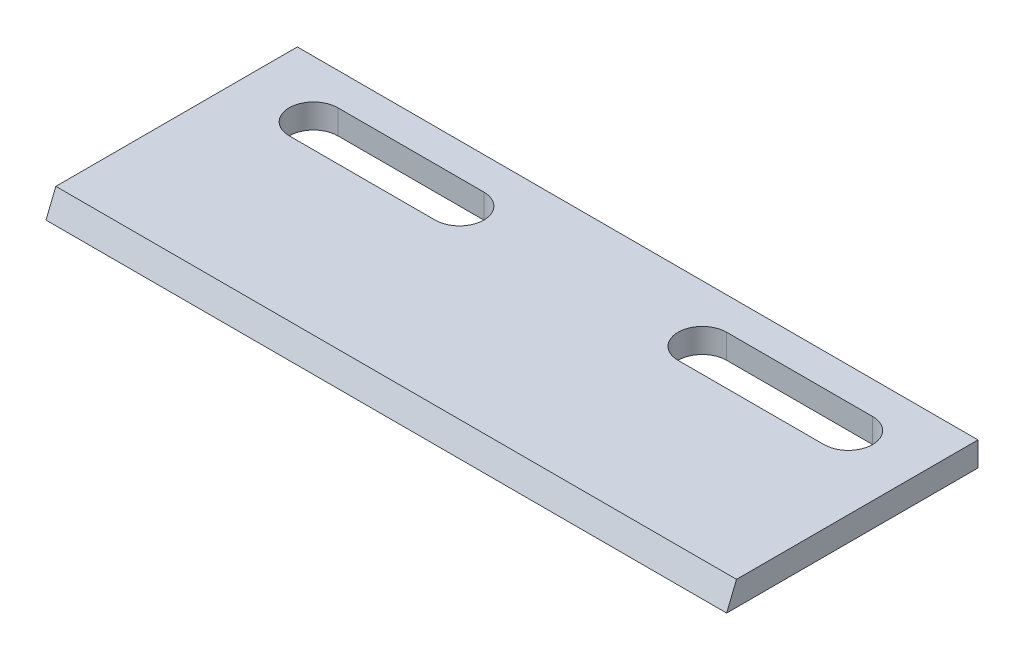
ISO-10303-21;
HEADER;
FILE_DESCRIPTION(('STEP AP214'),'2;1');
FILE_NAME('part.step','',(''),(''),'','','');
FILE_SCHEMA(('AUTOMOTIVE_DESIGN { 1 0 10303 214 1 1 1 1 }'));
ENDSEC;
DATA;
#1=APPLICATION_CONTEXT('core data for automotive mechanical design processes');
#2=APPLICATION_PROTOCOL_DEFINITION('international standard','automotive_design',2000,#1);
#3=PRODUCT_CONTEXT('',#1,'mechanical');
#4=PRODUCT('Part','Part','',(#3));
#5=PRODUCT_RELATED_PRODUCT_CATEGORY('part','',(#4));
#6=PRODUCT_DEFINITION_FORMATION('','',#4);
#7=PRODUCT_DEFINITION_CONTEXT('part definition',#1,'design');
#8=PRODUCT_DEFINITION('design','',#6,#7);
#9=PRODUCT_DEFINITION_SHAPE('','',#8);
#10=(LENGTH_UNIT() NAMED_UNIT(*) SI_UNIT(.MILLI.,.METRE.));
#11=(NAMED_UNIT(*) PLANE_ANGLE_UNIT() SI_UNIT($,.RADIAN.));
#12=(NAMED_UNIT(*) SI_UNIT($,.STERADIAN.) SOLID_ANGLE_UNIT());
#13=UNCERTAINTY_MEASURE_WITH_UNIT(LENGTH_MEASURE(1.E-05),#10,'distance_accuracy_value','');
#14=(GEOMETRIC_REPRESENTATION_CONTEXT(3) GLOBAL_UNCERTAINTY_ASSIGNED_CONTEXT((#13)) GLOBAL_UNIT_ASSIGNED_CONTEXT((#10,
#11,#12)) REPRESENTATION_CONTEXT('',''));
#15=CARTESIAN_POINT('',(0.,0.,0.));
#16=DIRECTION('',(0.,0.,1.));
#17=DIRECTION('',(1.,0.,0.));
#18=AXIS2_PLACEMENT_3D('',#15,#16,#17);
#19=CARTESIAN_POINT('',(266.573,3159.76000000058,-7002.77999492124));
#20=DIRECTION('',(-1.,0.,0.));
#21=DIRECTION('',(0.,0.,1.));
#22=AXIS2_PLACEMENT_3D('',#19,#20,#21);
#23=PLANE('',#22);
#24=DIRECTION('',(0.,0.,-1.));
#25=VECTOR('',#24,1.);
#26=CARTESIAN_POINT('',(266.573,3159.76000000058,-7002.77999492124));
#27=LINE('',#26,#25);
#28=CARTESIAN_POINT('',(266.573,3159.76000000057,-6813.61329483503));
#29=VERTEX_POINT('',#28);
#30=CARTESIAN_POINT('',(266.573,3159.76000000058,-7002.77999492124));
#31=VERTEX_POINT('',#30);
#32=EDGE_CURVE('E207',#29,#31,#27,.T.);
#33=ORIENTED_EDGE('',*,*,#32,.F.);
#34=DIRECTION('',(0.,0.927183854566795,-0.374606593415893));
#35=VECTOR('',#34,1.);
#36=CARTESIAN_POINT('',(266.573,3140.71000000057,-6805.91659523287));
#37=LINE('',#36,#35);
#38=CARTESIAN_POINT('',(266.573,3140.71000000057,-6805.91659523287));
#39=VERTEX_POINT('',#38);
#40=EDGE_CURVE('E166',#39,#29,#37,.T.);
#41=ORIENTED_EDGE('',*,*,#40,.F.);
#42=DIRECTION('',(0.,0.,-1.));
#43=VECTOR('',#42,1.);
#44=CARTESIAN_POINT('',(266.573,3140.71000000058,-7002.77999492124));
#45=LINE('',#44,#43);
#46=CARTESIAN_POINT('',(266.573,3140.71000000058,-7002.77999492124));
#47=VERTEX_POINT('',#46);
#48=EDGE_CURVE('E206',#39,#47,#45,.T.);
#49=ORIENTED_EDGE('',*,*,#48,.T.);
#50=DIRECTION('',(0.,-1.,0.));
#51=VECTOR('',#50,1.);
#52=CARTESIAN_POINT('',(266.573,3159.76000000058,-7002.77999492124));
#53=LINE('',#52,#51);
#54=EDGE_CURVE('E11',#31,#47,#53,.T.);
#55=ORIENTED_EDGE('',*,*,#54,.F.);
#56=EDGE_LOOP('',(#33,#41,#49,#55));
#57=FACE_BOUND('',#56,.T.);
#58=ADVANCED_FACE('F41',(#57),#23,.F.);
#59=CARTESIAN_POINT('',(266.573,3159.76000000058,-7002.77999492124));
#60=DIRECTION('',(0.,0.,1.));
#61=DIRECTION('',(0.,-1.,0.));
#62=AXIS2_PLACEMENT_3D('',#59,#60,#61);
#63=PLANE('',#62);
#64=DIRECTION('',(-1.,0.,0.));
#65=VECTOR('',#64,1.);
#66=CARTESIAN_POINT('',(266.573,3140.71000000058,-7002.77999492124));
#67=LINE('',#66,#65);
#68=CARTESIAN_POINT('',(-266.573000000001,3140.71000000058,-7002.77999492124));
#69=VERTEX_POINT('',#68);
#70=EDGE_CURVE('E217',#47,#69,#67,.T.);
#71=ORIENTED_EDGE('',*,*,#70,.T.);
#72=DIRECTION('',(0.,-1.,0.));
#73=VECTOR('',#72,1.);
#74=CARTESIAN_POINT('',(-266.573000000001,3159.76000000058,-7002.77999492124));
#75=LINE('',#74,#73);
#76=CARTESIAN_POINT('',(-266.573000000001,3159.76000000058,-7002.77999492124));
#77=VERTEX_POINT('',#76);
#78=EDGE_CURVE('E48',#77,#69,#75,.T.);
#79=ORIENTED_EDGE('',*,*,#78,.F.);
#80=DIRECTION('',(-1.,0.,0.));
#81=VECTOR('',#80,1.);
#82=CARTESIAN_POINT('',(266.573,3159.76000000058,-7002.77999492124));
#83=LINE('',#82,#81);
#84=EDGE_CURVE('E209',#31,#77,#83,.T.);
#85=ORIENTED_EDGE('',*,*,#84,.F.);
#86=ORIENTED_EDGE('',*,*,#54,.T.);
#87=EDGE_LOOP('',(#71,#79,#85,#86));
#88=FACE_BOUND('',#87,.T.);
#89=ADVANCED_FACE('F241',(#88),#63,.F.);
#90=CARTESIAN_POINT('',(-266.573000000001,3159.76000000058,-7002.77999492124));
#91=DIRECTION('',(1.,0.,0.));
#92=DIRECTION('',(0.,0.,-1.));
#93=AXIS2_PLACEMENT_3D('',#90,#91,#92);
#94=PLANE('',#93);
#95=DIRECTION('',(0.,0.,1.));
#96=VECTOR('',#95,1.);
#97=CARTESIAN_POINT('',(-266.573000000001,3140.71000000058,-7002.77999492124));
#98=LINE('',#97,#96);
#99=CARTESIAN_POINT('',(-266.573000000001,3140.71000000057,-6805.91659523287));
#100=VERTEX_POINT('',#99);
#101=EDGE_CURVE('E219',#69,#100,#98,.T.);
#102=ORIENTED_EDGE('',*,*,#101,.T.);
#103=DIRECTION('',(0.,0.927183854566795,-0.374606593415893));
#104=VECTOR('',#103,1.);
#105=CARTESIAN_POINT('',(-266.573000000001,3140.71000000057,-6805.91659523287));
#106=LINE('',#105,#104);
#107=CARTESIAN_POINT('',(-266.573000000001,3159.76000000057,-6813.61329483503));
#108=VERTEX_POINT('',#107);
#109=EDGE_CURVE('E199',#100,#108,#106,.T.);
#110=ORIENTED_EDGE('',*,*,#109,.T.);
#111=DIRECTION('',(0.,0.,1.));
#112=VECTOR('',#111,1.);
#113=CARTESIAN_POINT('',(-266.573000000001,3159.76000000058,-7002.77999492124));
#114=LINE('',#113,#112);
#115=EDGE_CURVE('E212',#77,#108,#114,.T.);
#116=ORIENTED_EDGE('',*,*,#115,.F.);
#117=ORIENTED_EDGE('',*,*,#78,.T.);
#118=EDGE_LOOP('',(#102,#110,#116,#117));
#119=FACE_BOUND('',#118,.T.);
#120=ADVANCED_FACE('F227',(#119),#94,.F.);
#121=CARTESIAN_POINT('',(0.,3159.76,2.63727140556786E-10));
#122=DIRECTION('',(0.,-1.,0.));
#123=DIRECTION('',(0.,0.,-1.));
#124=AXIS2_PLACEMENT_3D('',#121,#122,#123);
#125=PLANE('',#124);
#126=DIRECTION('',(-1.,0.,0.));
#127=VECTOR('',#126,1.);
#128=CARTESIAN_POINT('',(209.423,3159.76000000058,-6977.37999492124));
#129=LINE('',#128,#127);
#130=CARTESIAN_POINT('',(209.423,3159.76000000058,-6977.37999492124));
#131=VERTEX_POINT('',#130);
#132=CARTESIAN_POINT('',(95.1230000000004,3159.76000000058,-6977.37999492124));
#133=VERTEX_POINT('',#132);
#134=EDGE_CURVE('E159',#131,#133,#129,.T.);
#135=ORIENTED_EDGE('',*,*,#134,.F.);
#136=CARTESIAN_POINT('',(209.423,3159.76000000058,-6958.32999492124));
#137=DIRECTION('',(0.,1.,0.));
#138=DIRECTION('',(0.,0.,1.));
#139=AXIS2_PLACEMENT_3D('',#136,#137,#138);
#140=CIRCLE('',#139,19.05);
#141=CARTESIAN_POINT('',(209.423,3159.76000000058,-6939.27999492123));
#142=VERTEX_POINT('',#141);
#143=EDGE_CURVE('E55',#142,#131,#140,.T.);
#144=ORIENTED_EDGE('',*,*,#143,.F.);
#145=DIRECTION('',(1.,0.,0.));
#146=VECTOR('',#145,1.);
#147=CARTESIAN_POINT('',(209.423,3159.76000000058,-6939.27999492123));
#148=LINE('',#147,#146);
#149=CARTESIAN_POINT('',(95.1230000000004,3159.76000000058,-6939.27999492123));
#150=VERTEX_POINT('',#149);
#151=EDGE_CURVE('E150',#150,#142,#148,.T.);
#152=ORIENTED_EDGE('',*,*,#151,.F.);
#153=CARTESIAN_POINT('',(95.1230000000004,3159.76000000058,-6958.32999492124));
#154=DIRECTION('',(0.,1.,0.));
#155=DIRECTION('',(0.,0.,1.));
#156=AXIS2_PLACEMENT_3D('',#153,#154,#155);
#157=CIRCLE('',#156,19.05);
#158=EDGE_CURVE('E153',#133,#150,#157,.T.);
#159=ORIENTED_EDGE('',*,*,#158,.F.);
#160=EDGE_LOOP('',(#135,#144,#152,#159));
#161=FACE_BOUND('',#160,.T.);
#162=DIRECTION('',(1.,0.,0.));
#163=VECTOR('',#162,1.);
#164=CARTESIAN_POINT('',(-209.423000000001,3159.76000000058,-6939.27999492123));
#165=LINE('',#164,#163);
#166=CARTESIAN_POINT('',(-209.423000000001,3159.76000000058,-6939.27999492123));
#167=VERTEX_POINT('',#166);
#168=CARTESIAN_POINT('',(-95.1230000000008,3159.76000000058,-6939.27999492123));
#169=VERTEX_POINT('',#168);
#170=EDGE_CURVE('E185',#167,#169,#165,.T.);
#171=ORIENTED_EDGE('',*,*,#170,.F.);
#172=CARTESIAN_POINT('',(-209.423000000001,3159.76000000058,-6958.32999492124));
#173=DIRECTION('',(0.,1.,0.));
#174=DIRECTION('',(0.,0.,-1.));
#175=AXIS2_PLACEMENT_3D('',#172,#173,#174);
#176=CIRCLE('',#175,19.05);
#177=CARTESIAN_POINT('',(-209.423000000001,3159.76000000058,-6977.37999492124));
#178=VERTEX_POINT('',#177);
#179=EDGE_CURVE('E63',#178,#167,#176,.T.);
#180=ORIENTED_EDGE('',*,*,#179,.F.);
#181=DIRECTION('',(-1.,0.,0.));
#182=VECTOR('',#181,1.);
#183=CARTESIAN_POINT('',(-209.423000000001,3159.76000000058,-6977.37999492124));
#184=LINE('',#183,#182);
#185=CARTESIAN_POINT('',(-95.1230000000008,3159.76000000058,-6977.37999492124));
#186=VERTEX_POINT('',#185);
#187=EDGE_CURVE('E174',#186,#178,#184,.T.);
#188=ORIENTED_EDGE('',*,*,#187,.F.);
#189=CARTESIAN_POINT('',(-95.1230000000008,3159.76000000058,-6958.32999492124));
#190=DIRECTION('',(0.,1.,0.));
#191=DIRECTION('',(0.,0.,-1.));
#192=AXIS2_PLACEMENT_3D('',#189,#190,#191);
#193=CIRCLE('',#192,19.05);
#194=EDGE_CURVE('E188',#169,#186,#193,.T.);
#195=ORIENTED_EDGE('',*,*,#194,.F.);
#196=EDGE_LOOP('',(#171,#180,#188,#195));
#197=FACE_BOUND('',#196,.T.);
#198=ORIENTED_EDGE('',*,*,#115,.T.);
#199=DIRECTION('',(1.,0.,0.));
#200=VECTOR('',#199,1.);
#201=CARTESIAN_POINT('',(-266.573000000001,3159.76000000057,-6813.61329483503));
#202=LINE('',#201,#200);
#203=EDGE_CURVE('E202',#108,#29,#202,.T.);
#204=ORIENTED_EDGE('',*,*,#203,.T.);
#205=ORIENTED_EDGE('',*,*,#32,.T.);
#206=ORIENTED_EDGE('',*,*,#84,.T.);
#207=EDGE_LOOP('',(#198,#204,#205,#206));
#208=FACE_BOUND('',#207,.T.);
#209=ADVANCED_FACE('F240',(#161,#197,#208),#125,.F.);
#210=CARTESIAN_POINT('',(0.,3140.71,2.62140909410353E-10));
#211=DIRECTION('',(0.,-1.,0.));
#212=DIRECTION('',(0.,0.,-1.));
#213=AXIS2_PLACEMENT_3D('',#210,#211,#212);
#214=PLANE('',#213);
#215=CARTESIAN_POINT('',(209.423,3140.71000000056,-6958.32999492124));
#216=DIRECTION('',(0.,1.,0.));
#217=DIRECTION('',(0.,0.,1.));
#218=AXIS2_PLACEMENT_3D('',#215,#216,#217);
#219=CIRCLE('',#218,19.05);
#220=CARTESIAN_POINT('',(209.423,3140.71000000056,-6939.27999492124));
#221=VERTEX_POINT('',#220);
#222=CARTESIAN_POINT('',(209.423,3140.71000000056,-6977.37999492124));
#223=VERTEX_POINT('',#222);
#224=EDGE_CURVE('E131',#221,#223,#219,.T.);
#225=ORIENTED_EDGE('',*,*,#224,.T.);
#226=DIRECTION('',(-1.,0.,0.));
#227=VECTOR('',#226,1.);
#228=CARTESIAN_POINT('',(209.423,3140.71000000056,-6977.37999492124));
#229=LINE('',#228,#227);
#230=CARTESIAN_POINT('',(95.1230000000004,3140.71000000058,-6977.37999492124));
#231=VERTEX_POINT('',#230);
#232=EDGE_CURVE('E141',#223,#231,#229,.T.);
#233=ORIENTED_EDGE('',*,*,#232,.T.);
#234=CARTESIAN_POINT('',(95.1230000000004,3140.71000000056,-6958.32999492124));
#235=DIRECTION('',(0.,1.,0.));
#236=DIRECTION('',(0.,0.,1.));
#237=AXIS2_PLACEMENT_3D('',#234,#235,#236);
#238=CIRCLE('',#237,19.05);
#239=CARTESIAN_POINT('',(95.1230000000004,3140.71000000056,-6939.27999492124));
#240=VERTEX_POINT('',#239);
#241=EDGE_CURVE('E145',#231,#240,#238,.T.);
#242=ORIENTED_EDGE('',*,*,#241,.T.);
#243=DIRECTION('',(1.,0.,0.));
#244=VECTOR('',#243,1.);
#245=CARTESIAN_POINT('',(209.423,3140.71000000056,-6939.27999492124));
#246=LINE('',#245,#244);
#247=EDGE_CURVE('E137',#240,#221,#246,.T.);
#248=ORIENTED_EDGE('',*,*,#247,.T.);
#249=EDGE_LOOP('',(#225,#233,#242,#248));
#250=FACE_BOUND('',#249,.T.);
#251=CARTESIAN_POINT('',(-209.423000000001,3140.71000000056,-6958.32999492124));
#252=DIRECTION('',(0.,1.,0.));
#253=DIRECTION('',(0.,0.,-1.));
#254=AXIS2_PLACEMENT_3D('',#251,#252,#253);
#255=CIRCLE('',#254,19.05);
#256=CARTESIAN_POINT('',(-209.423000000001,3140.71000000056,-6977.37999492124));
#257=VERTEX_POINT('',#256);
#258=CARTESIAN_POINT('',(-209.423000000001,3140.71000000056,-6939.27999492124));
#259=VERTEX_POINT('',#258);
#260=EDGE_CURVE('E170',#257,#259,#255,.T.);
#261=ORIENTED_EDGE('',*,*,#260,.T.);
#262=DIRECTION('',(1.,0.,0.));
#263=VECTOR('',#262,1.);
#264=CARTESIAN_POINT('',(-209.423000000001,3140.71000000056,-6939.27999492124));
#265=LINE('',#264,#263);
#266=CARTESIAN_POINT('',(-95.1230000000008,3140.71000000058,-6939.27999492124));
#267=VERTEX_POINT('',#266);
#268=EDGE_CURVE('E173',#259,#267,#265,.T.);
#269=ORIENTED_EDGE('',*,*,#268,.T.);
#270=CARTESIAN_POINT('',(-95.1230000000008,3140.71000000056,-6958.32999492124));
#271=DIRECTION('',(0.,1.,0.));
#272=DIRECTION('',(0.,0.,-1.));
#273=AXIS2_PLACEMENT_3D('',#270,#271,#272);
#274=CIRCLE('',#273,19.05);
#275=CARTESIAN_POINT('',(-95.1230000000008,3140.71000000056,-6977.37999492124));
#276=VERTEX_POINT('',#275);
#277=EDGE_CURVE('E177',#267,#276,#274,.T.);
#278=ORIENTED_EDGE('',*,*,#277,.T.);
#279=DIRECTION('',(-1.,0.,0.));
#280=VECTOR('',#279,1.);
#281=CARTESIAN_POINT('',(-209.423000000001,3140.71000000056,-6977.37999492124));
#282=LINE('',#281,#280);
#283=EDGE_CURVE('E180',#276,#257,#282,.T.);
#284=ORIENTED_EDGE('',*,*,#283,.T.);
#285=EDGE_LOOP('',(#261,#269,#278,#284));
#286=FACE_BOUND('',#285,.T.);
#287=ORIENTED_EDGE('',*,*,#48,.F.);
#288=DIRECTION('',(1.,0.,0.));
#289=VECTOR('',#288,1.);
#290=CARTESIAN_POINT('',(266.573,3140.71000000057,-6805.91659523287));
#291=LINE('',#290,#289);
#292=EDGE_CURVE('E210',#100,#39,#291,.T.);
#293=ORIENTED_EDGE('',*,*,#292,.F.);
#294=ORIENTED_EDGE('',*,*,#101,.F.);
#295=ORIENTED_EDGE('',*,*,#70,.F.);
#296=EDGE_LOOP('',(#287,#293,#294,#295));
#297=FACE_BOUND('',#296,.T.);
#298=ADVANCED_FACE('F147',(#250,#286,#297),#214,.T.);
#299=CARTESIAN_POINT('',(-266.573000000001,3140.71000000057,-6805.91659523287));
#300=DIRECTION('',(0.,-0.374606593415893,-0.927183854566795));
#301=DIRECTION('',(0.,0.927183854566795,-0.374606593415893));
#302=AXIS2_PLACEMENT_3D('',#299,#300,#301);
#303=PLANE('',#302);
#304=ORIENTED_EDGE('',*,*,#40,.T.);
#305=ORIENTED_EDGE('',*,*,#203,.F.);
#306=ORIENTED_EDGE('',*,*,#109,.F.);
#307=ORIENTED_EDGE('',*,*,#292,.T.);
#308=EDGE_LOOP('',(#304,#305,#306,#307));
#309=FACE_BOUND('',#308,.T.);
#310=ADVANCED_FACE('F235',(#309),#303,.F.);
#311=CARTESIAN_POINT('',(-209.423000000001,3140.71000000056,-6958.32999492124));
#312=DIRECTION('',(0.,1.,0.));
#313=DIRECTION('',(0.,0.,1.));
#314=AXIS2_PLACEMENT_3D('',#311,#312,#313);
#315=CYLINDRICAL_SURFACE('',#314,19.05);
#316=ORIENTED_EDGE('',*,*,#179,.T.);
#317=DIRECTION('',(0.,1.,0.));
#318=VECTOR('',#317,1.);
#319=CARTESIAN_POINT('',(-209.423000000001,3140.71000000056,-6939.27999492124));
#320=LINE('',#319,#318);
#321=EDGE_CURVE('E183',#259,#167,#320,.T.);
#322=ORIENTED_EDGE('',*,*,#321,.F.);
#323=ORIENTED_EDGE('',*,*,#260,.F.);
#324=DIRECTION('',(0.,1.,0.));
#325=VECTOR('',#324,1.);
#326=CARTESIAN_POINT('',(-209.423000000001,3140.71000000056,-6977.37999492124));
#327=LINE('',#326,#325);
#328=EDGE_CURVE('E160',#257,#178,#327,.T.);
#329=ORIENTED_EDGE('',*,*,#328,.T.);
#330=EDGE_LOOP('',(#316,#322,#323,#329));
#331=FACE_BOUND('',#330,.T.);
#332=ADVANCED_FACE('F256',(#331),#315,.F.);
#333=CARTESIAN_POINT('',(-209.423000000001,3140.71000000056,-6977.37999492124));
#334=DIRECTION('',(0.,0.,-1.));
#335=DIRECTION('',(0.,1.,0.));
#336=AXIS2_PLACEMENT_3D('',#333,#334,#335);
#337=PLANE('',#336);
#338=ORIENTED_EDGE('',*,*,#187,.T.);
#339=ORIENTED_EDGE('',*,*,#328,.F.);
#340=ORIENTED_EDGE('',*,*,#283,.F.);
#341=DIRECTION('',(0.,1.,0.));
#342=VECTOR('',#341,1.);
#343=CARTESIAN_POINT('',(-95.1230000000008,3140.71000000056,-6977.37999492124));
#344=LINE('',#343,#342);
#345=EDGE_CURVE('E194',#276,#186,#344,.T.);
#346=ORIENTED_EDGE('',*,*,#345,.T.);
#347=EDGE_LOOP('',(#338,#339,#340,#346));
#348=FACE_BOUND('',#347,.T.);
#349=ADVANCED_FACE('F259',(#348),#337,.F.);
#350=CARTESIAN_POINT('',(-95.1230000000008,3140.71000000056,-6958.32999492124));
#351=DIRECTION('',(0.,1.,0.));
#352=DIRECTION('',(0.,0.,1.));
#353=AXIS2_PLACEMENT_3D('',#350,#351,#352);
#354=CYLINDRICAL_SURFACE('',#353,19.05);
#355=ORIENTED_EDGE('',*,*,#194,.T.);
#356=ORIENTED_EDGE('',*,*,#345,.F.);
#357=ORIENTED_EDGE('',*,*,#277,.F.);
#358=DIRECTION('',(0.,1.,0.));
#359=VECTOR('',#358,1.);
#360=CARTESIAN_POINT('',(-95.1230000000008,3140.71000000056,-6939.27999492124));
#361=LINE('',#360,#359);
#362=EDGE_CURVE('E196',#267,#169,#361,.T.);
#363=ORIENTED_EDGE('',*,*,#362,.T.);
#364=EDGE_LOOP('',(#355,#356,#357,#363));
#365=FACE_BOUND('',#364,.T.);
#366=ADVANCED_FACE('F263',(#365),#354,.F.);
#367=CARTESIAN_POINT('',(-209.423000000001,3140.71000000056,-6939.27999492124));
#368=DIRECTION('',(0.,0.,1.));
#369=DIRECTION('',(0.,-1.,0.));
#370=AXIS2_PLACEMENT_3D('',#367,#368,#369);
#371=PLANE('',#370);
#372=ORIENTED_EDGE('',*,*,#170,.T.);
#373=ORIENTED_EDGE('',*,*,#362,.F.);
#374=ORIENTED_EDGE('',*,*,#268,.F.);
#375=ORIENTED_EDGE('',*,*,#321,.T.);
#376=EDGE_LOOP('',(#372,#373,#374,#375));
#377=FACE_BOUND('',#376,.T.);
#378=ADVANCED_FACE('F260',(#377),#371,.F.);
#379=CARTESIAN_POINT('',(209.423,3140.71000000056,-6958.32999492124));
#380=DIRECTION('',(0.,1.,0.));
#381=DIRECTION('',(0.,0.,1.));
#382=AXIS2_PLACEMENT_3D('',#379,#380,#381);
#383=CYLINDRICAL_SURFACE('',#382,19.05);
#384=ORIENTED_EDGE('',*,*,#143,.T.);
#385=DIRECTION('',(0.,1.,0.));
#386=VECTOR('',#385,1.);
#387=CARTESIAN_POINT('',(209.423,3140.71000000056,-6977.37999492124));
#388=LINE('',#387,#386);
#389=EDGE_CURVE('E127',#223,#131,#388,.T.);
#390=ORIENTED_EDGE('',*,*,#389,.F.);
#391=ORIENTED_EDGE('',*,*,#224,.F.);
#392=DIRECTION('',(0.,1.,0.));
#393=VECTOR('',#392,1.);
#394=CARTESIAN_POINT('',(209.423,3140.71000000056,-6939.27999492124));
#395=LINE('',#394,#393);
#396=EDGE_CURVE('E164',#221,#142,#395,.T.);
#397=ORIENTED_EDGE('',*,*,#396,.T.);
#398=EDGE_LOOP('',(#384,#390,#391,#397));
#399=FACE_BOUND('',#398,.T.);
#400=ADVANCED_FACE('F129',(#399),#383,.F.);
#401=CARTESIAN_POINT('',(209.423,3140.71000000056,-6939.27999492124));
#402=DIRECTION('',(0.,0.,1.));
#403=DIRECTION('',(0.,-1.,0.));
#404=AXIS2_PLACEMENT_3D('',#401,#402,#403);
#405=PLANE('',#404);
#406=ORIENTED_EDGE('',*,*,#151,.T.);
#407=ORIENTED_EDGE('',*,*,#396,.F.);
#408=ORIENTED_EDGE('',*,*,#247,.F.);
#409=DIRECTION('',(0.,1.,0.));
#410=VECTOR('',#409,1.);
#411=CARTESIAN_POINT('',(95.1230000000004,3140.71000000056,-6939.27999492124));
#412=LINE('',#411,#410);
#413=EDGE_CURVE('E167',#240,#150,#412,.T.);
#414=ORIENTED_EDGE('',*,*,#413,.T.);
#415=EDGE_LOOP('',(#406,#407,#408,#414));
#416=FACE_BOUND('',#415,.T.);
#417=ADVANCED_FACE('F273',(#416),#405,.F.);
#418=CARTESIAN_POINT('',(95.1230000000004,3140.71000000056,-6958.32999492124));
#419=DIRECTION('',(0.,1.,0.));
#420=DIRECTION('',(0.,0.,1.));
#421=AXIS2_PLACEMENT_3D('',#418,#419,#420);
#422=CYLINDRICAL_SURFACE('',#421,19.05);
#423=ORIENTED_EDGE('',*,*,#158,.T.);
#424=ORIENTED_EDGE('',*,*,#413,.F.);
#425=ORIENTED_EDGE('',*,*,#241,.F.);
#426=DIRECTION('',(0.,1.,0.));
#427=VECTOR('',#426,1.);
#428=CARTESIAN_POINT('',(95.1230000000004,3140.71000000056,-6977.37999492124));
#429=LINE('',#428,#427);
#430=EDGE_CURVE('E136',#231,#133,#429,.T.);
#431=ORIENTED_EDGE('',*,*,#430,.T.);
#432=EDGE_LOOP('',(#423,#424,#425,#431));
#433=FACE_BOUND('',#432,.T.);
#434=ADVANCED_FACE('F276',(#433),#422,.F.);
#435=CARTESIAN_POINT('',(209.423,3140.71000000056,-6977.37999492124));
#436=DIRECTION('',(0.,0.,-1.));
#437=DIRECTION('',(0.,1.,0.));
#438=AXIS2_PLACEMENT_3D('',#435,#436,#437);
#439=PLANE('',#438);
#440=ORIENTED_EDGE('',*,*,#134,.T.);
#441=ORIENTED_EDGE('',*,*,#430,.F.);
#442=ORIENTED_EDGE('',*,*,#232,.F.);
#443=ORIENTED_EDGE('',*,*,#389,.T.);
#444=EDGE_LOOP('',(#440,#441,#442,#443));
#445=FACE_BOUND('',#444,.T.);
#446=ADVANCED_FACE('F142',(#445),#439,.F.);
#447=CLOSED_SHELL('',(#58,#89,#120,#209,#298,#310,#332,#349,#366,#378,#400,#417,#434,#446));
#448=MANIFOLD_SOLID_BREP('B2',#447);
#449=ADVANCED_BREP_SHAPE_REPRESENTATION('',(#18,#448),#14);
#450=SHAPE_DEFINITION_REPRESENTATION(#9,#449);
ENDSEC;
END-ISO-10303-21;
